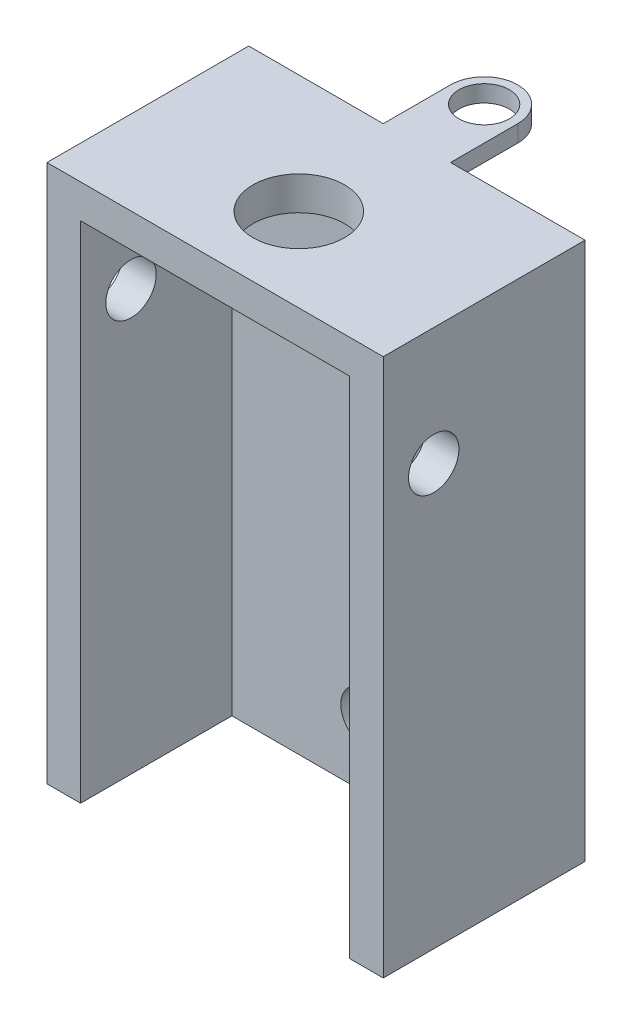
ISO-10303-21;
HEADER;
FILE_DESCRIPTION(('STEP AP214'),'2;1');
FILE_NAME('part.step','',(''),(''),'','','');
FILE_SCHEMA(('AUTOMOTIVE_DESIGN { 1 0 10303 214 1 1 1 1 }'));
ENDSEC;
DATA;
#1=APPLICATION_CONTEXT('core data for automotive mechanical design processes');
#2=APPLICATION_PROTOCOL_DEFINITION('international standard','automotive_design',2000,#1);
#3=PRODUCT_CONTEXT('',#1,'mechanical');
#4=PRODUCT('Part','Part','',(#3));
#5=PRODUCT_RELATED_PRODUCT_CATEGORY('part','',(#4));
#6=PRODUCT_DEFINITION_FORMATION('','',#4);
#7=PRODUCT_DEFINITION_CONTEXT('part definition',#1,'design');
#8=PRODUCT_DEFINITION('design','',#6,#7);
#9=PRODUCT_DEFINITION_SHAPE('','',#8);
#10=(LENGTH_UNIT() NAMED_UNIT(*) SI_UNIT(.MILLI.,.METRE.));
#11=(NAMED_UNIT(*) PLANE_ANGLE_UNIT() SI_UNIT($,.RADIAN.));
#12=(NAMED_UNIT(*) SI_UNIT($,.STERADIAN.) SOLID_ANGLE_UNIT());
#13=UNCERTAINTY_MEASURE_WITH_UNIT(LENGTH_MEASURE(1.E-05),#10,'distance_accuracy_value','');
#14=(GEOMETRIC_REPRESENTATION_CONTEXT(3) GLOBAL_UNCERTAINTY_ASSIGNED_CONTEXT((#13)) GLOBAL_UNIT_ASSIGNED_CONTEXT((#10,
#11,#12)) REPRESENTATION_CONTEXT('',''));
#15=CARTESIAN_POINT('',(0.,0.,0.));
#16=DIRECTION('',(0.,0.,1.));
#17=DIRECTION('',(1.,0.,0.));
#18=AXIS2_PLACEMENT_3D('',#15,#16,#17);
#19=CARTESIAN_POINT('',(0.,0.,0.));
#20=DIRECTION('',(0.,0.,1.));
#21=DIRECTION('',(1.,0.,0.));
#22=AXIS2_PLACEMENT_3D('',#19,#20,#21);
#23=PLANE('',#22);
#24=CARTESIAN_POINT('',(0.,-12.162643372392,0.));
#25=DIRECTION('',(0.,0.,1.));
#26=DIRECTION('',(1.,0.,0.));
#27=AXIS2_PLACEMENT_3D('',#24,#25,#26);
#28=CIRCLE('',#27,1.524);
#29=CARTESIAN_POINT('',(1.52400000000001,-12.162643372392,0.));
#30=VERTEX_POINT('',#29);
#31=EDGE_CURVE('E225',#30,#30,#28,.T.);
#32=ORIENTED_EDGE('',*,*,#31,.T.);
#33=EDGE_LOOP('',(#32));
#34=FACE_BOUND('',#33,.T.);
#35=DIRECTION('',(0.,1.,0.));
#36=VECTOR('',#35,1.);
#37=CARTESIAN_POINT('',(-2.,15.,0.));
#38=LINE('',#37,#36);
#39=CARTESIAN_POINT('',(-2.,15.,0.));
#40=VERTEX_POINT('',#39);
#41=CARTESIAN_POINT('',(-2.,16.,0.));
#42=VERTEX_POINT('',#41);
#43=EDGE_CURVE('E155',#40,#42,#38,.T.);
#44=ORIENTED_EDGE('',*,*,#43,.F.);
#45=DIRECTION('',(1.,0.,0.));
#46=VECTOR('',#45,1.);
#47=CARTESIAN_POINT('',(2.,15.,0.));
#48=LINE('',#47,#46);
#49=CARTESIAN_POINT('',(2.,15.,0.));
#50=VERTEX_POINT('',#49);
#51=EDGE_CURVE('E148',#40,#50,#48,.T.);
#52=ORIENTED_EDGE('',*,*,#51,.T.);
#53=DIRECTION('',(0.,1.,0.));
#54=VECTOR('',#53,1.);
#55=CARTESIAN_POINT('',(2.,15.,0.));
#56=LINE('',#55,#54);
#57=CARTESIAN_POINT('',(2.,16.,0.));
#58=VERTEX_POINT('',#57);
#59=EDGE_CURVE('E134',#50,#58,#56,.T.);
#60=ORIENTED_EDGE('',*,*,#59,.T.);
#61=DIRECTION('',(-1.,0.,0.));
#62=VECTOR('',#61,1.);
#63=CARTESIAN_POINT('',(-10.,16.,0.));
#64=LINE('',#63,#62);
#65=CARTESIAN_POINT('',(10.,16.,0.));
#66=VERTEX_POINT('',#65);
#67=EDGE_CURVE('E239',#66,#58,#64,.T.);
#68=ORIENTED_EDGE('',*,*,#67,.F.);
#69=DIRECTION('',(0.,1.,0.));
#70=VECTOR('',#69,1.);
#71=CARTESIAN_POINT('',(10.,16.,0.));
#72=LINE('',#71,#70);
#73=CARTESIAN_POINT('',(10.,-16.,0.));
#74=VERTEX_POINT('',#73);
#75=EDGE_CURVE('E229',#74,#66,#72,.T.);
#76=ORIENTED_EDGE('',*,*,#75,.F.);
#77=DIRECTION('',(1.,0.,0.));
#78=VECTOR('',#77,1.);
#79=CARTESIAN_POINT('',(-10.,-16.,0.));
#80=LINE('',#79,#78);
#81=CARTESIAN_POINT('',(-10.,-16.,0.));
#82=VERTEX_POINT('',#81);
#83=EDGE_CURVE('E235',#82,#74,#80,.T.);
#84=ORIENTED_EDGE('',*,*,#83,.F.);
#85=DIRECTION('',(0.,-1.,0.));
#86=VECTOR('',#85,1.);
#87=CARTESIAN_POINT('',(-10.,16.,0.));
#88=LINE('',#87,#86);
#89=CARTESIAN_POINT('',(-10.,16.,0.));
#90=VERTEX_POINT('',#89);
#91=EDGE_CURVE('E241',#90,#82,#88,.T.);
#92=ORIENTED_EDGE('',*,*,#91,.F.);
#93=EDGE_CURVE('E238',#42,#90,#64,.T.);
#94=ORIENTED_EDGE('',*,*,#93,.F.);
#95=EDGE_LOOP('',(#44,#52,#60,#68,#76,#84,#92,#94));
#96=FACE_BOUND('',#95,.T.);
#97=ADVANCED_FACE('F45',(#34,#96),#23,.F.);
#98=CARTESIAN_POINT('',(0.,0.,3.));
#99=DIRECTION('',(0.,0.,1.));
#100=DIRECTION('',(1.,0.,0.));
#101=AXIS2_PLACEMENT_3D('',#98,#99,#100);
#102=PLANE('',#101);
#103=CARTESIAN_POINT('',(0.,-12.162643372392,3.));
#104=DIRECTION('',(0.,0.,1.));
#105=DIRECTION('',(1.,0.,0.));
#106=AXIS2_PLACEMENT_3D('',#103,#104,#105);
#107=CIRCLE('',#106,1.524);
#108=CARTESIAN_POINT('',(1.52400000000001,-12.162643372392,3.));
#109=VERTEX_POINT('',#108);
#110=EDGE_CURVE('E226',#109,#109,#107,.T.);
#111=ORIENTED_EDGE('',*,*,#110,.F.);
#112=EDGE_LOOP('',(#111));
#113=FACE_BOUND('',#112,.T.);
#114=DIRECTION('',(-1.,0.,0.));
#115=VECTOR('',#114,1.);
#116=CARTESIAN_POINT('',(0.,14.,3.));
#117=LINE('',#116,#115);
#118=CARTESIAN_POINT('',(8.,14.,3.));
#119=VERTEX_POINT('',#118);
#120=CARTESIAN_POINT('',(-8.,14.,3.));
#121=VERTEX_POINT('',#120);
#122=EDGE_CURVE('E70',#119,#121,#117,.T.);
#123=ORIENTED_EDGE('',*,*,#122,.T.);
#124=DIRECTION('',(0.,-1.,0.));
#125=VECTOR('',#124,1.);
#126=CARTESIAN_POINT('',(-8.,0.,3.));
#127=LINE('',#126,#125);
#128=CARTESIAN_POINT('',(-8.,-16.,3.));
#129=VERTEX_POINT('',#128);
#130=EDGE_CURVE('E222',#121,#129,#127,.T.);
#131=ORIENTED_EDGE('',*,*,#130,.T.);
#132=DIRECTION('',(1.,0.,0.));
#133=VECTOR('',#132,1.);
#134=CARTESIAN_POINT('',(-10.,-16.,3.));
#135=LINE('',#134,#133);
#136=CARTESIAN_POINT('',(8.,-16.,3.));
#137=VERTEX_POINT('',#136);
#138=EDGE_CURVE('E232',#129,#137,#135,.T.);
#139=ORIENTED_EDGE('',*,*,#138,.T.);
#140=DIRECTION('',(0.,1.,0.));
#141=VECTOR('',#140,1.);
#142=CARTESIAN_POINT('',(8.,0.,3.));
#143=LINE('',#142,#141);
#144=EDGE_CURVE('E220',#137,#119,#143,.T.);
#145=ORIENTED_EDGE('',*,*,#144,.T.);
#146=EDGE_LOOP('',(#123,#131,#139,#145));
#147=FACE_BOUND('',#146,.T.);
#148=ADVANCED_FACE('F273',(#113,#147),#102,.T.);
#149=CARTESIAN_POINT('',(10.,16.,3.));
#150=DIRECTION('',(-1.,0.,0.));
#151=DIRECTION('',(0.,-1.,0.));
#152=AXIS2_PLACEMENT_3D('',#149,#150,#151);
#153=PLANE('',#152);
#154=CARTESIAN_POINT('',(10.,9.,9.));
#155=DIRECTION('',(1.,0.,0.));
#156=DIRECTION('',(0.,0.,-1.));
#157=AXIS2_PLACEMENT_3D('',#154,#155,#156);
#158=CIRCLE('',#157,1.5);
#159=CARTESIAN_POINT('',(10.,9.,7.5));
#160=VERTEX_POINT('',#159);
#161=EDGE_CURVE('E172',#160,#160,#158,.T.);
#162=ORIENTED_EDGE('',*,*,#161,.F.);
#163=EDGE_LOOP('',(#162));
#164=FACE_BOUND('',#163,.T.);
#165=ORIENTED_EDGE('',*,*,#75,.T.);
#166=DIRECTION('',(0.,0.,-1.));
#167=VECTOR('',#166,1.);
#168=CARTESIAN_POINT('',(10.,16.,3.));
#169=LINE('',#168,#167);
#170=CARTESIAN_POINT('',(10.,16.,12.));
#171=VERTEX_POINT('',#170);
#172=EDGE_CURVE('E13',#171,#66,#169,.T.);
#173=ORIENTED_EDGE('',*,*,#172,.F.);
#174=DIRECTION('',(0.,1.,0.));
#175=VECTOR('',#174,1.);
#176=CARTESIAN_POINT('',(10.,-16.,12.));
#177=LINE('',#176,#175);
#178=CARTESIAN_POINT('',(10.,-16.,12.));
#179=VERTEX_POINT('',#178);
#180=EDGE_CURVE('E188',#179,#171,#177,.T.);
#181=ORIENTED_EDGE('',*,*,#180,.F.);
#182=DIRECTION('',(0.,0.,-1.));
#183=VECTOR('',#182,1.);
#184=CARTESIAN_POINT('',(10.,-16.,3.));
#185=LINE('',#184,#183);
#186=EDGE_CURVE('E234',#179,#74,#185,.T.);
#187=ORIENTED_EDGE('',*,*,#186,.T.);
#188=EDGE_LOOP('',(#165,#173,#181,#187));
#189=FACE_BOUND('',#188,.T.);
#190=ADVANCED_FACE('F47',(#164,#189),#153,.F.);
#191=CARTESIAN_POINT('',(-10.,16.,3.));
#192=DIRECTION('',(0.,-1.,0.));
#193=DIRECTION('',(0.,0.,-1.));
#194=AXIS2_PLACEMENT_3D('',#191,#192,#193);
#195=PLANE('',#194);
#196=CARTESIAN_POINT('',(0.,16.,7.024));
#197=DIRECTION('',(0.,1.,0.));
#198=DIRECTION('',(0.,0.,1.));
#199=AXIS2_PLACEMENT_3D('',#196,#197,#198);
#200=CIRCLE('',#199,2.725);
#201=CARTESIAN_POINT('',(0.,16.,9.749));
#202=VERTEX_POINT('',#201);
#203=EDGE_CURVE('E184',#202,#202,#200,.T.);
#204=ORIENTED_EDGE('',*,*,#203,.F.);
#205=EDGE_LOOP('',(#204));
#206=FACE_BOUND('',#205,.T.);
#207=ORIENTED_EDGE('',*,*,#67,.T.);
#208=DIRECTION('',(0.,0.,-1.));
#209=VECTOR('',#208,1.);
#210=CARTESIAN_POINT('',(2.,16.,-4.));
#211=LINE('',#210,#209);
#212=CARTESIAN_POINT('',(2.,16.,-4.));
#213=VERTEX_POINT('',#212);
#214=EDGE_CURVE('E62',#58,#213,#211,.T.);
#215=ORIENTED_EDGE('',*,*,#214,.T.);
#216=CARTESIAN_POINT('',(0.,16.,-4.));
#217=DIRECTION('',(0.,1.,0.));
#218=DIRECTION('',(0.,0.,-1.));
#219=AXIS2_PLACEMENT_3D('',#216,#217,#218);
#220=CIRCLE('',#219,2.);
#221=CARTESIAN_POINT('',(-2.,16.,-4.));
#222=VERTEX_POINT('',#221);
#223=EDGE_CURVE('E159',#213,#222,#220,.T.);
#224=ORIENTED_EDGE('',*,*,#223,.T.);
#225=DIRECTION('',(0.,0.,1.));
#226=VECTOR('',#225,1.);
#227=CARTESIAN_POINT('',(-2.,16.,0.));
#228=LINE('',#227,#226);
#229=EDGE_CURVE('E156',#222,#42,#228,.T.);
#230=ORIENTED_EDGE('',*,*,#229,.T.);
#231=ORIENTED_EDGE('',*,*,#93,.T.);
#232=DIRECTION('',(0.,0.,-1.));
#233=VECTOR('',#232,1.);
#234=CARTESIAN_POINT('',(-10.,16.,3.));
#235=LINE('',#234,#233);
#236=CARTESIAN_POINT('',(-10.,16.,12.));
#237=VERTEX_POINT('',#236);
#238=EDGE_CURVE('E54',#237,#90,#235,.T.);
#239=ORIENTED_EDGE('',*,*,#238,.F.);
#240=DIRECTION('',(-1.,0.,0.));
#241=VECTOR('',#240,1.);
#242=CARTESIAN_POINT('',(10.,16.,12.));
#243=LINE('',#242,#241);
#244=EDGE_CURVE('E191',#171,#237,#243,.T.);
#245=ORIENTED_EDGE('',*,*,#244,.F.);
#246=ORIENTED_EDGE('',*,*,#172,.T.);
#247=EDGE_LOOP('',(#207,#215,#224,#230,#231,#239,#245,#246));
#248=FACE_BOUND('',#247,.T.);
#249=CARTESIAN_POINT('',(0.,16.,-4.));
#250=DIRECTION('',(0.,1.,0.));
#251=DIRECTION('',(0.,0.,1.));
#252=AXIS2_PLACEMENT_3D('',#249,#250,#251);
#253=CIRCLE('',#252,1.5);
#254=CARTESIAN_POINT('',(0.,16.,-2.5));
#255=VERTEX_POINT('',#254);
#256=EDGE_CURVE('E162',#255,#255,#253,.T.);
#257=ORIENTED_EDGE('',*,*,#256,.F.);
#258=EDGE_LOOP('',(#257));
#259=FACE_BOUND('',#258,.T.);
#260=ADVANCED_FACE('F290',(#206,#248,#259),#195,.F.);
#261=CARTESIAN_POINT('',(-10.,16.,3.));
#262=DIRECTION('',(1.,0.,0.));
#263=DIRECTION('',(0.,1.,0.));
#264=AXIS2_PLACEMENT_3D('',#261,#262,#263);
#265=PLANE('',#264);
#266=CARTESIAN_POINT('',(-10.,9.,9.));
#267=DIRECTION('',(1.,0.,0.));
#268=DIRECTION('',(0.,0.,-1.));
#269=AXIS2_PLACEMENT_3D('',#266,#267,#268);
#270=CIRCLE('',#269,1.5);
#271=CARTESIAN_POINT('',(-10.,9.,7.5));
#272=VERTEX_POINT('',#271);
#273=EDGE_CURVE('E178',#272,#272,#270,.T.);
#274=ORIENTED_EDGE('',*,*,#273,.T.);
#275=EDGE_LOOP('',(#274));
#276=FACE_BOUND('',#275,.T.);
#277=ORIENTED_EDGE('',*,*,#91,.T.);
#278=DIRECTION('',(0.,0.,-1.));
#279=VECTOR('',#278,1.);
#280=CARTESIAN_POINT('',(-10.,-16.,3.));
#281=LINE('',#280,#279);
#282=CARTESIAN_POINT('',(-10.,-16.,12.));
#283=VERTEX_POINT('',#282);
#284=EDGE_CURVE('E246',#283,#82,#281,.T.);
#285=ORIENTED_EDGE('',*,*,#284,.F.);
#286=DIRECTION('',(0.,-1.,0.));
#287=VECTOR('',#286,1.);
#288=CARTESIAN_POINT('',(-10.,16.,12.));
#289=LINE('',#288,#287);
#290=EDGE_CURVE('E194',#237,#283,#289,.T.);
#291=ORIENTED_EDGE('',*,*,#290,.F.);
#292=ORIENTED_EDGE('',*,*,#238,.T.);
#293=EDGE_LOOP('',(#277,#285,#291,#292));
#294=FACE_BOUND('',#293,.T.);
#295=ADVANCED_FACE('F287',(#276,#294),#265,.F.);
#296=CARTESIAN_POINT('',(-10.,-16.,3.));
#297=DIRECTION('',(0.,1.,0.));
#298=DIRECTION('',(0.,0.,1.));
#299=AXIS2_PLACEMENT_3D('',#296,#297,#298);
#300=PLANE('',#299);
#301=ORIENTED_EDGE('',*,*,#186,.F.);
#302=DIRECTION('',(1.,0.,0.));
#303=VECTOR('',#302,1.);
#304=CARTESIAN_POINT('',(8.,-16.,12.));
#305=LINE('',#304,#303);
#306=CARTESIAN_POINT('',(8.,-16.,12.));
#307=VERTEX_POINT('',#306);
#308=EDGE_CURVE('E205',#307,#179,#305,.T.);
#309=ORIENTED_EDGE('',*,*,#308,.F.);
#310=DIRECTION('',(0.,0.,-1.));
#311=VECTOR('',#310,1.);
#312=CARTESIAN_POINT('',(8.,-16.,12.));
#313=LINE('',#312,#311);
#314=EDGE_CURVE('E208',#307,#137,#313,.T.);
#315=ORIENTED_EDGE('',*,*,#314,.T.);
#316=ORIENTED_EDGE('',*,*,#138,.F.);
#317=DIRECTION('',(0.,0.,-1.));
#318=VECTOR('',#317,1.);
#319=CARTESIAN_POINT('',(-8.,-16.,12.));
#320=LINE('',#319,#318);
#321=CARTESIAN_POINT('',(-8.,-16.,12.));
#322=VERTEX_POINT('',#321);
#323=EDGE_CURVE('E217',#322,#129,#320,.T.);
#324=ORIENTED_EDGE('',*,*,#323,.F.);
#325=DIRECTION('',(1.,0.,0.));
#326=VECTOR('',#325,1.);
#327=CARTESIAN_POINT('',(-10.,-16.,12.));
#328=LINE('',#327,#326);
#329=EDGE_CURVE('E197',#283,#322,#328,.T.);
#330=ORIENTED_EDGE('',*,*,#329,.F.);
#331=ORIENTED_EDGE('',*,*,#284,.T.);
#332=ORIENTED_EDGE('',*,*,#83,.T.);
#333=EDGE_LOOP('',(#301,#309,#315,#316,#324,#330,#331,#332));
#334=FACE_BOUND('',#333,.T.);
#335=ADVANCED_FACE('F283',(#334),#300,.F.);
#336=CARTESIAN_POINT('',(0.,-12.162643372392,3.));
#337=DIRECTION('',(0.,0.,-1.));
#338=DIRECTION('',(-1.,0.,0.));
#339=AXIS2_PLACEMENT_3D('',#336,#337,#338);
#340=CYLINDRICAL_SURFACE('',#339,1.524);
#341=ORIENTED_EDGE('',*,*,#110,.T.);
#342=EDGE_LOOP('',(#341));
#343=FACE_BOUND('',#342,.T.);
#344=ORIENTED_EDGE('',*,*,#31,.F.);
#345=EDGE_LOOP('',(#344));
#346=FACE_BOUND('',#345,.T.);
#347=ADVANCED_FACE('F286',(#343,#346),#340,.F.);
#348=CARTESIAN_POINT('',(-8.,14.,12.));
#349=DIRECTION('',(-1.,0.,0.));
#350=DIRECTION('',(0.,-1.,0.));
#351=AXIS2_PLACEMENT_3D('',#348,#349,#350);
#352=PLANE('',#351);
#353=CARTESIAN_POINT('',(-8.,9.,9.));
#354=DIRECTION('',(-1.,0.,0.));
#355=DIRECTION('',(0.,-1.,0.));
#356=AXIS2_PLACEMENT_3D('',#353,#354,#355);
#357=CIRCLE('',#356,1.5);
#358=CARTESIAN_POINT('',(-8.,7.5,9.));
#359=VERTEX_POINT('',#358);
#360=EDGE_CURVE('E181',#359,#359,#357,.T.);
#361=ORIENTED_EDGE('',*,*,#360,.T.);
#362=EDGE_LOOP('',(#361));
#363=FACE_BOUND('',#362,.T.);
#364=ORIENTED_EDGE('',*,*,#130,.F.);
#365=DIRECTION('',(0.,0.,-1.));
#366=VECTOR('',#365,1.);
#367=CARTESIAN_POINT('',(-8.,14.,12.));
#368=LINE('',#367,#366);
#369=CARTESIAN_POINT('',(-8.,14.,12.));
#370=VERTEX_POINT('',#369);
#371=EDGE_CURVE('E214',#370,#121,#368,.T.);
#372=ORIENTED_EDGE('',*,*,#371,.F.);
#373=DIRECTION('',(0.,1.,0.));
#374=VECTOR('',#373,1.);
#375=CARTESIAN_POINT('',(-8.,14.,12.));
#376=LINE('',#375,#374);
#377=EDGE_CURVE('E199',#322,#370,#376,.T.);
#378=ORIENTED_EDGE('',*,*,#377,.F.);
#379=ORIENTED_EDGE('',*,*,#323,.T.);
#380=EDGE_LOOP('',(#364,#372,#378,#379));
#381=FACE_BOUND('',#380,.T.);
#382=ADVANCED_FACE('F333',(#363,#381),#352,.F.);
#383=CARTESIAN_POINT('',(8.,14.,12.));
#384=DIRECTION('',(0.,1.,0.));
#385=DIRECTION('',(0.,0.,1.));
#386=AXIS2_PLACEMENT_3D('',#383,#384,#385);
#387=PLANE('',#386);
#388=CARTESIAN_POINT('',(0.,14.,7.024));
#389=DIRECTION('',(0.,1.,0.));
#390=DIRECTION('',(0.,0.,1.));
#391=AXIS2_PLACEMENT_3D('',#388,#389,#390);
#392=CIRCLE('',#391,2.725);
#393=CARTESIAN_POINT('',(0.,14.,9.749));
#394=VERTEX_POINT('',#393);
#395=EDGE_CURVE('E187',#394,#394,#392,.T.);
#396=ORIENTED_EDGE('',*,*,#395,.T.);
#397=EDGE_LOOP('',(#396));
#398=FACE_BOUND('',#397,.T.);
#399=ORIENTED_EDGE('',*,*,#122,.F.);
#400=DIRECTION('',(0.,0.,-1.));
#401=VECTOR('',#400,1.);
#402=CARTESIAN_POINT('',(8.,14.,12.));
#403=LINE('',#402,#401);
#404=CARTESIAN_POINT('',(8.,14.,12.));
#405=VERTEX_POINT('',#404);
#406=EDGE_CURVE('E211',#405,#119,#403,.T.);
#407=ORIENTED_EDGE('',*,*,#406,.F.);
#408=DIRECTION('',(1.,0.,0.));
#409=VECTOR('',#408,1.);
#410=CARTESIAN_POINT('',(8.,14.,12.));
#411=LINE('',#410,#409);
#412=EDGE_CURVE('E201',#370,#405,#411,.T.);
#413=ORIENTED_EDGE('',*,*,#412,.F.);
#414=ORIENTED_EDGE('',*,*,#371,.T.);
#415=EDGE_LOOP('',(#399,#407,#413,#414));
#416=FACE_BOUND('',#415,.T.);
#417=ADVANCED_FACE('F253',(#398,#416),#387,.F.);
#418=CARTESIAN_POINT('',(8.,-16.,12.));
#419=DIRECTION('',(1.,0.,0.));
#420=DIRECTION('',(0.,1.,0.));
#421=AXIS2_PLACEMENT_3D('',#418,#419,#420);
#422=PLANE('',#421);
#423=CARTESIAN_POINT('',(8.,9.,9.));
#424=DIRECTION('',(1.,0.,0.));
#425=DIRECTION('',(0.,1.,0.));
#426=AXIS2_PLACEMENT_3D('',#423,#424,#425);
#427=CIRCLE('',#426,1.5);
#428=CARTESIAN_POINT('',(8.,10.5,9.));
#429=VERTEX_POINT('',#428);
#430=EDGE_CURVE('E49',#429,#429,#427,.T.);
#431=ORIENTED_EDGE('',*,*,#430,.T.);
#432=EDGE_LOOP('',(#431));
#433=FACE_BOUND('',#432,.T.);
#434=ORIENTED_EDGE('',*,*,#144,.F.);
#435=ORIENTED_EDGE('',*,*,#314,.F.);
#436=DIRECTION('',(0.,-1.,0.));
#437=VECTOR('',#436,1.);
#438=CARTESIAN_POINT('',(8.,-16.,12.));
#439=LINE('',#438,#437);
#440=EDGE_CURVE('E203',#405,#307,#439,.T.);
#441=ORIENTED_EDGE('',*,*,#440,.F.);
#442=ORIENTED_EDGE('',*,*,#406,.T.);
#443=EDGE_LOOP('',(#434,#435,#441,#442));
#444=FACE_BOUND('',#443,.T.);
#445=ADVANCED_FACE('F269',(#433,#444),#422,.F.);
#446=CARTESIAN_POINT('',(0.,0.,12.));
#447=DIRECTION('',(0.,0.,1.));
#448=DIRECTION('',(1.,0.,0.));
#449=AXIS2_PLACEMENT_3D('',#446,#447,#448);
#450=PLANE('',#449);
#451=ORIENTED_EDGE('',*,*,#180,.T.);
#452=ORIENTED_EDGE('',*,*,#244,.T.);
#453=ORIENTED_EDGE('',*,*,#290,.T.);
#454=ORIENTED_EDGE('',*,*,#329,.T.);
#455=ORIENTED_EDGE('',*,*,#377,.T.);
#456=ORIENTED_EDGE('',*,*,#412,.T.);
#457=ORIENTED_EDGE('',*,*,#440,.T.);
#458=ORIENTED_EDGE('',*,*,#308,.T.);
#459=EDGE_LOOP('',(#451,#452,#453,#454,#455,#456,#457,#458));
#460=FACE_BOUND('',#459,.T.);
#461=ADVANCED_FACE('F259',(#460),#450,.T.);
#462=CARTESIAN_POINT('',(0.,-16.,7.024));
#463=DIRECTION('',(0.,1.,0.));
#464=DIRECTION('',(0.,0.,1.));
#465=AXIS2_PLACEMENT_3D('',#462,#463,#464);
#466=CYLINDRICAL_SURFACE('',#465,2.725);
#467=ORIENTED_EDGE('',*,*,#203,.T.);
#468=EDGE_LOOP('',(#467));
#469=FACE_BOUND('',#468,.T.);
#470=ORIENTED_EDGE('',*,*,#395,.F.);
#471=EDGE_LOOP('',(#470));
#472=FACE_BOUND('',#471,.T.);
#473=ADVANCED_FACE('F256',(#469,#472),#466,.F.);
#474=CARTESIAN_POINT('',(-10.,9.,9.));
#475=DIRECTION('',(1.,0.,0.));
#476=DIRECTION('',(0.,0.,-1.));
#477=AXIS2_PLACEMENT_3D('',#474,#475,#476);
#478=CYLINDRICAL_SURFACE('',#477,1.5);
#479=ORIENTED_EDGE('',*,*,#161,.T.);
#480=EDGE_LOOP('',(#479));
#481=FACE_BOUND('',#480,.T.);
#482=ORIENTED_EDGE('',*,*,#430,.F.);
#483=EDGE_LOOP('',(#482));
#484=FACE_BOUND('',#483,.T.);
#485=ADVANCED_FACE('F258',(#481,#484),#478,.F.);
#486=ORIENTED_EDGE('',*,*,#273,.F.);
#487=EDGE_LOOP('',(#486));
#488=FACE_BOUND('',#487,.T.);
#489=ORIENTED_EDGE('',*,*,#360,.F.);
#490=EDGE_LOOP('',(#489));
#491=FACE_BOUND('',#490,.T.);
#492=ADVANCED_FACE('F266',(#488,#491),#478,.F.);
#493=CARTESIAN_POINT('',(-2.,15.,0.));
#494=DIRECTION('',(-1.,0.,0.));
#495=DIRECTION('',(0.,0.,1.));
#496=AXIS2_PLACEMENT_3D('',#493,#494,#495);
#497=PLANE('',#496);
#498=ORIENTED_EDGE('',*,*,#229,.F.);
#499=DIRECTION('',(0.,1.,0.));
#500=VECTOR('',#499,1.);
#501=CARTESIAN_POINT('',(-2.,15.,-4.));
#502=LINE('',#501,#500);
#503=CARTESIAN_POINT('',(-2.,15.,-4.));
#504=VERTEX_POINT('',#503);
#505=EDGE_CURVE('E173',#504,#222,#502,.T.);
#506=ORIENTED_EDGE('',*,*,#505,.F.);
#507=DIRECTION('',(0.,0.,1.));
#508=VECTOR('',#507,1.);
#509=CARTESIAN_POINT('',(-2.,15.,0.));
#510=LINE('',#509,#508);
#511=EDGE_CURVE('E142',#504,#40,#510,.T.);
#512=ORIENTED_EDGE('',*,*,#511,.T.);
#513=ORIENTED_EDGE('',*,*,#43,.T.);
#514=EDGE_LOOP('',(#498,#506,#512,#513));
#515=FACE_BOUND('',#514,.T.);
#516=ADVANCED_FACE('F316',(#515),#497,.T.);
#517=CARTESIAN_POINT('',(0.,15.,-4.));
#518=DIRECTION('',(0.,1.,0.));
#519=DIRECTION('',(0.,0.,1.));
#520=AXIS2_PLACEMENT_3D('',#517,#518,#519);
#521=CYLINDRICAL_SURFACE('',#520,2.);
#522=ORIENTED_EDGE('',*,*,#223,.F.);
#523=DIRECTION('',(0.,1.,0.));
#524=VECTOR('',#523,1.);
#525=CARTESIAN_POINT('',(2.,15.,-4.));
#526=LINE('',#525,#524);
#527=CARTESIAN_POINT('',(2.,15.,-4.));
#528=VERTEX_POINT('',#527);
#529=EDGE_CURVE('E141',#528,#213,#526,.T.);
#530=ORIENTED_EDGE('',*,*,#529,.F.);
#531=CARTESIAN_POINT('',(0.,15.,-4.));
#532=DIRECTION('',(0.,1.,0.));
#533=DIRECTION('',(0.,0.,-1.));
#534=AXIS2_PLACEMENT_3D('',#531,#532,#533);
#535=CIRCLE('',#534,2.);
#536=EDGE_CURVE('E151',#528,#504,#535,.T.);
#537=ORIENTED_EDGE('',*,*,#536,.T.);
#538=ORIENTED_EDGE('',*,*,#505,.T.);
#539=EDGE_LOOP('',(#522,#530,#537,#538));
#540=FACE_BOUND('',#539,.T.);
#541=ADVANCED_FACE('F319',(#540),#521,.T.);
#542=CARTESIAN_POINT('',(2.,15.,-4.));
#543=DIRECTION('',(1.,0.,0.));
#544=DIRECTION('',(0.,0.,-1.));
#545=AXIS2_PLACEMENT_3D('',#542,#543,#544);
#546=PLANE('',#545);
#547=ORIENTED_EDGE('',*,*,#214,.F.);
#548=ORIENTED_EDGE('',*,*,#59,.F.);
#549=DIRECTION('',(0.,0.,-1.));
#550=VECTOR('',#549,1.);
#551=CARTESIAN_POINT('',(2.,15.,-4.));
#552=LINE('',#551,#550);
#553=EDGE_CURVE('E137',#50,#528,#552,.T.);
#554=ORIENTED_EDGE('',*,*,#553,.T.);
#555=ORIENTED_EDGE('',*,*,#529,.T.);
#556=EDGE_LOOP('',(#547,#548,#554,#555));
#557=FACE_BOUND('',#556,.T.);
#558=ADVANCED_FACE('F136',(#557),#546,.T.);
#559=CARTESIAN_POINT('',(0.,15.,-4.));
#560=DIRECTION('',(0.,-1.,0.));
#561=DIRECTION('',(0.,0.,-1.));
#562=AXIS2_PLACEMENT_3D('',#559,#560,#561);
#563=PLANE('',#562);
#564=CARTESIAN_POINT('',(0.,15.,-4.));
#565=DIRECTION('',(0.,1.,0.));
#566=DIRECTION('',(0.,0.,1.));
#567=AXIS2_PLACEMENT_3D('',#564,#565,#566);
#568=CIRCLE('',#567,1.5);
#569=CARTESIAN_POINT('',(0.,15.,-2.5));
#570=VERTEX_POINT('',#569);
#571=EDGE_CURVE('E168',#570,#570,#568,.T.);
#572=ORIENTED_EDGE('',*,*,#571,.T.);
#573=EDGE_LOOP('',(#572));
#574=FACE_BOUND('',#573,.T.);
#575=ORIENTED_EDGE('',*,*,#51,.F.);
#576=ORIENTED_EDGE('',*,*,#511,.F.);
#577=ORIENTED_EDGE('',*,*,#536,.F.);
#578=ORIENTED_EDGE('',*,*,#553,.F.);
#579=EDGE_LOOP('',(#575,#576,#577,#578));
#580=FACE_BOUND('',#579,.T.);
#581=ADVANCED_FACE('F146',(#574,#580),#563,.T.);
#582=CARTESIAN_POINT('',(0.,15.,-4.));
#583=DIRECTION('',(0.,1.,0.));
#584=DIRECTION('',(0.,0.,1.));
#585=AXIS2_PLACEMENT_3D('',#582,#583,#584);
#586=CYLINDRICAL_SURFACE('',#585,1.5);
#587=ORIENTED_EDGE('',*,*,#571,.F.);
#588=EDGE_LOOP('',(#587));
#589=FACE_BOUND('',#588,.T.);
#590=ORIENTED_EDGE('',*,*,#256,.T.);
#591=EDGE_LOOP('',(#590));
#592=FACE_BOUND('',#591,.T.);
#593=ADVANCED_FACE('F308',(#589,#592),#586,.F.);
#594=CLOSED_SHELL('',(#97,#148,#190,#260,#295,#335,#347,#382,#417,#445,#461,#473,#485,#492,#516,
#541,#558,#581,#593));
#595=MANIFOLD_SOLID_BREP('B2',#594);
#596=ADVANCED_BREP_SHAPE_REPRESENTATION('',(#18,#595),#14);
#597=SHAPE_DEFINITION_REPRESENTATION(#9,#596);
ENDSEC;
END-ISO-10303-21;
